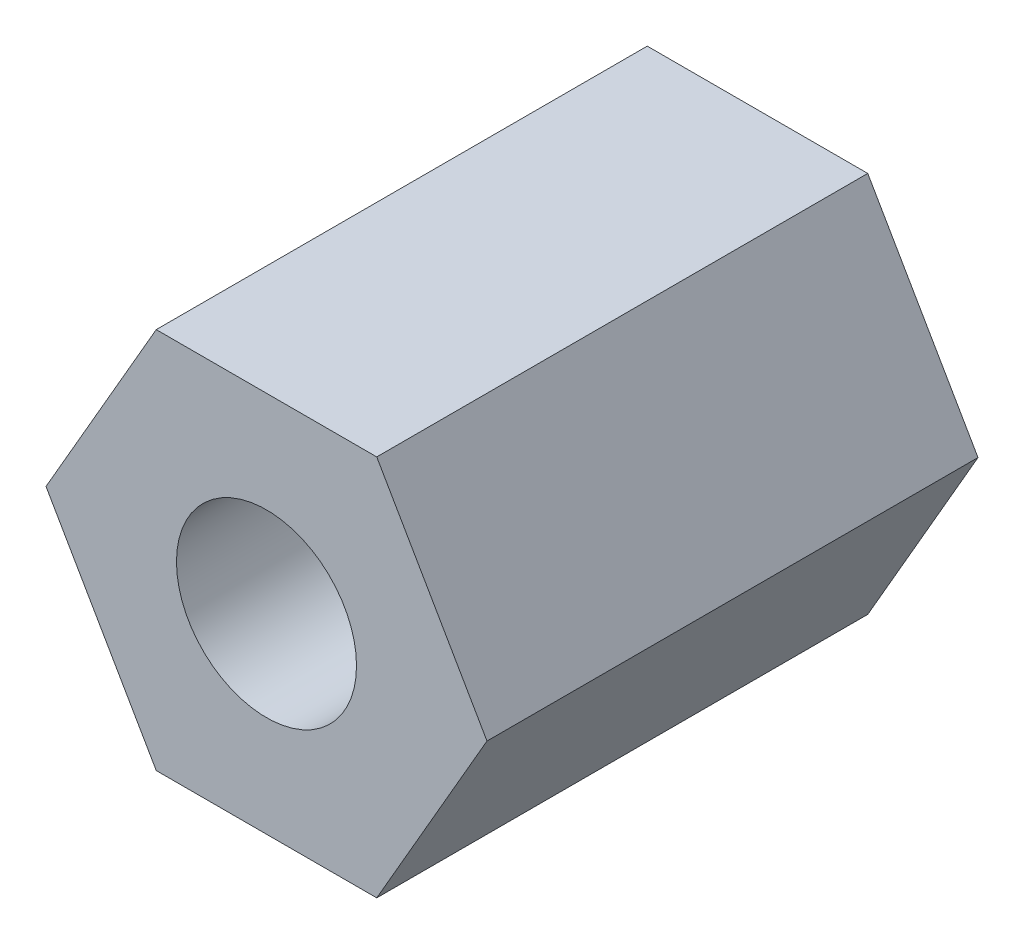
ISO-10303-21;
HEADER;
FILE_DESCRIPTION(('STEP AP214'),'2;1');
FILE_NAME('part.step','',(''),(''),'','','');
FILE_SCHEMA(('AUTOMOTIVE_DESIGN { 1 0 10303 214 1 1 1 1 }'));
ENDSEC;
DATA;
#1=APPLICATION_CONTEXT('core data for automotive mechanical design processes');
#2=APPLICATION_PROTOCOL_DEFINITION('international standard','automotive_design',2000,#1);
#3=PRODUCT_CONTEXT('',#1,'mechanical');
#4=PRODUCT('Part','Part','',(#3));
#5=PRODUCT_RELATED_PRODUCT_CATEGORY('part','',(#4));
#6=PRODUCT_DEFINITION_FORMATION('','',#4);
#7=PRODUCT_DEFINITION_CONTEXT('part definition',#1,'design');
#8=PRODUCT_DEFINITION('design','',#6,#7);
#9=PRODUCT_DEFINITION_SHAPE('','',#8);
#10=(LENGTH_UNIT() NAMED_UNIT(*) SI_UNIT(.MILLI.,.METRE.));
#11=(NAMED_UNIT(*) PLANE_ANGLE_UNIT() SI_UNIT($,.RADIAN.));
#12=(NAMED_UNIT(*) SI_UNIT($,.STERADIAN.) SOLID_ANGLE_UNIT());
#13=UNCERTAINTY_MEASURE_WITH_UNIT(LENGTH_MEASURE(1.E-05),#10,'distance_accuracy_value','');
#14=(GEOMETRIC_REPRESENTATION_CONTEXT(3) GLOBAL_UNCERTAINTY_ASSIGNED_CONTEXT((#13)) GLOBAL_UNIT_ASSIGNED_CONTEXT((#10,
#11,#12)) REPRESENTATION_CONTEXT('',''));
#15=CARTESIAN_POINT('',(0.,0.,0.));
#16=DIRECTION('',(0.,0.,1.));
#17=DIRECTION('',(1.,0.,0.));
#18=AXIS2_PLACEMENT_3D('',#15,#16,#17);
#19=CARTESIAN_POINT('',(2.02072594216369,3.5,9.));
#20=DIRECTION('',(0.,-1.,0.));
#21=DIRECTION('',(1.,0.,0.));
#22=AXIS2_PLACEMENT_3D('',#19,#20,#21);
#23=PLANE('',#22);
#24=DIRECTION('',(-1.,0.,0.));
#25=VECTOR('',#24,1.);
#26=CARTESIAN_POINT('',(2.02072594216369,3.5,0.));
#27=LINE('',#26,#25);
#28=CARTESIAN_POINT('',(2.02072594216369,3.5,0.));
#29=VERTEX_POINT('',#28);
#30=CARTESIAN_POINT('',(-2.02072594216369,3.5,0.));
#31=VERTEX_POINT('',#30);
#32=EDGE_CURVE('E117',#29,#31,#27,.T.);
#33=ORIENTED_EDGE('',*,*,#32,.T.);
#34=DIRECTION('',(0.,0.,-1.));
#35=VECTOR('',#34,1.);
#36=CARTESIAN_POINT('',(-2.02072594216369,3.5,9.));
#37=LINE('',#36,#35);
#38=CARTESIAN_POINT('',(-2.02072594216369,3.5,9.));
#39=VERTEX_POINT('',#38);
#40=EDGE_CURVE('E11',#39,#31,#37,.T.);
#41=ORIENTED_EDGE('',*,*,#40,.F.);
#42=DIRECTION('',(-1.,0.,0.));
#43=VECTOR('',#42,1.);
#44=CARTESIAN_POINT('',(2.02072594216369,3.5,9.));
#45=LINE('',#44,#43);
#46=CARTESIAN_POINT('',(2.02072594216369,3.5,9.));
#47=VERTEX_POINT('',#46);
#48=EDGE_CURVE('E128',#47,#39,#45,.T.);
#49=ORIENTED_EDGE('',*,*,#48,.F.);
#50=DIRECTION('',(0.,0.,-1.));
#51=VECTOR('',#50,1.);
#52=CARTESIAN_POINT('',(2.02072594216369,3.5,9.));
#53=LINE('',#52,#51);
#54=EDGE_CURVE('E113',#47,#29,#53,.T.);
#55=ORIENTED_EDGE('',*,*,#54,.T.);
#56=EDGE_LOOP('',(#33,#41,#49,#55));
#57=FACE_BOUND('',#56,.T.);
#58=ADVANCED_FACE('F33',(#57),#23,.F.);
#59=CARTESIAN_POINT('',(-2.02072594216369,3.5,9.));
#60=DIRECTION('',(0.866025403784439,-0.5,0.));
#61=DIRECTION('',(0.5,0.866025403784439,0.));
#62=AXIS2_PLACEMENT_3D('',#59,#60,#61);
#63=PLANE('',#62);
#64=DIRECTION('',(-0.5,-0.866025403784439,0.));
#65=VECTOR('',#64,1.);
#66=CARTESIAN_POINT('',(-2.02072594216369,3.5,0.));
#67=LINE('',#66,#65);
#68=CARTESIAN_POINT('',(-4.04145188432738,0.,0.));
#69=VERTEX_POINT('',#68);
#70=EDGE_CURVE('E120',#31,#69,#67,.T.);
#71=ORIENTED_EDGE('',*,*,#70,.T.);
#72=DIRECTION('',(0.,0.,-1.));
#73=VECTOR('',#72,1.);
#74=CARTESIAN_POINT('',(-4.04145188432738,0.,9.));
#75=LINE('',#74,#73);
#76=CARTESIAN_POINT('',(-4.04145188432738,0.,9.));
#77=VERTEX_POINT('',#76);
#78=EDGE_CURVE('E41',#77,#69,#75,.T.);
#79=ORIENTED_EDGE('',*,*,#78,.F.);
#80=DIRECTION('',(-0.5,-0.866025403784439,0.));
#81=VECTOR('',#80,1.);
#82=CARTESIAN_POINT('',(-2.02072594216369,3.5,9.));
#83=LINE('',#82,#81);
#84=EDGE_CURVE('E86',#39,#77,#83,.T.);
#85=ORIENTED_EDGE('',*,*,#84,.F.);
#86=ORIENTED_EDGE('',*,*,#40,.T.);
#87=EDGE_LOOP('',(#71,#79,#85,#86));
#88=FACE_BOUND('',#87,.T.);
#89=ADVANCED_FACE('F153',(#88),#63,.F.);
#90=CARTESIAN_POINT('',(-4.04145188432738,0.,9.));
#91=DIRECTION('',(0.866025403784438,0.5,0.));
#92=DIRECTION('',(-0.5,0.866025403784439,0.));
#93=AXIS2_PLACEMENT_3D('',#90,#91,#92);
#94=PLANE('',#93);
#95=DIRECTION('',(0.5,-0.866025403784438,0.));
#96=VECTOR('',#95,1.);
#97=CARTESIAN_POINT('',(-4.04145188432738,0.,0.));
#98=LINE('',#97,#96);
#99=CARTESIAN_POINT('',(-2.02072594216369,-3.5,0.));
#100=VERTEX_POINT('',#99);
#101=EDGE_CURVE('E123',#69,#100,#98,.T.);
#102=ORIENTED_EDGE('',*,*,#101,.T.);
#103=DIRECTION('',(0.,0.,-1.));
#104=VECTOR('',#103,1.);
#105=CARTESIAN_POINT('',(-2.02072594216369,-3.5,9.));
#106=LINE('',#105,#104);
#107=CARTESIAN_POINT('',(-2.02072594216369,-3.5,9.));
#108=VERTEX_POINT('',#107);
#109=EDGE_CURVE('E108',#108,#100,#106,.T.);
#110=ORIENTED_EDGE('',*,*,#109,.F.);
#111=DIRECTION('',(0.5,-0.866025403784438,0.));
#112=VECTOR('',#111,1.);
#113=CARTESIAN_POINT('',(-4.04145188432738,0.,9.));
#114=LINE('',#113,#112);
#115=EDGE_CURVE('E99',#77,#108,#114,.T.);
#116=ORIENTED_EDGE('',*,*,#115,.F.);
#117=ORIENTED_EDGE('',*,*,#78,.T.);
#118=EDGE_LOOP('',(#102,#110,#116,#117));
#119=FACE_BOUND('',#118,.T.);
#120=ADVANCED_FACE('F134',(#119),#94,.F.);
#121=CARTESIAN_POINT('',(-2.02072594216369,-3.5,9.));
#122=DIRECTION('',(0.,1.,0.));
#123=DIRECTION('',(-1.,0.,0.));
#124=AXIS2_PLACEMENT_3D('',#121,#122,#123);
#125=PLANE('',#124);
#126=DIRECTION('',(1.,0.,0.));
#127=VECTOR('',#126,1.);
#128=CARTESIAN_POINT('',(-2.02072594216369,-3.5,0.));
#129=LINE('',#128,#127);
#130=CARTESIAN_POINT('',(2.02072594216369,-3.5,0.));
#131=VERTEX_POINT('',#130);
#132=EDGE_CURVE('E107',#100,#131,#129,.T.);
#133=ORIENTED_EDGE('',*,*,#132,.T.);
#134=DIRECTION('',(0.,0.,-1.));
#135=VECTOR('',#134,1.);
#136=CARTESIAN_POINT('',(2.02072594216369,-3.5,9.));
#137=LINE('',#136,#135);
#138=CARTESIAN_POINT('',(2.02072594216369,-3.5,9.));
#139=VERTEX_POINT('',#138);
#140=EDGE_CURVE('E104',#139,#131,#137,.T.);
#141=ORIENTED_EDGE('',*,*,#140,.F.);
#142=DIRECTION('',(1.,0.,0.));
#143=VECTOR('',#142,1.);
#144=CARTESIAN_POINT('',(-2.02072594216369,-3.5,9.));
#145=LINE('',#144,#143);
#146=EDGE_CURVE('E93',#108,#139,#145,.T.);
#147=ORIENTED_EDGE('',*,*,#146,.F.);
#148=ORIENTED_EDGE('',*,*,#109,.T.);
#149=EDGE_LOOP('',(#133,#141,#147,#148));
#150=FACE_BOUND('',#149,.T.);
#151=ADVANCED_FACE('F105',(#150),#125,.F.);
#152=CARTESIAN_POINT('',(2.02072594216369,-3.5,9.));
#153=DIRECTION('',(-0.866025403784439,0.5,0.));
#154=DIRECTION('',(-0.5,-0.866025403784439,0.));
#155=AXIS2_PLACEMENT_3D('',#152,#153,#154);
#156=PLANE('',#155);
#157=DIRECTION('',(0.5,0.866025403784439,0.));
#158=VECTOR('',#157,1.);
#159=CARTESIAN_POINT('',(2.02072594216369,-3.5,0.));
#160=LINE('',#159,#158);
#161=CARTESIAN_POINT('',(4.04145188432738,0.,0.));
#162=VERTEX_POINT('',#161);
#163=EDGE_CURVE('E72',#131,#162,#160,.T.);
#164=ORIENTED_EDGE('',*,*,#163,.T.);
#165=DIRECTION('',(0.,0.,-1.));
#166=VECTOR('',#165,1.);
#167=CARTESIAN_POINT('',(4.04145188432738,0.,9.));
#168=LINE('',#167,#166);
#169=CARTESIAN_POINT('',(4.04145188432738,0.,9.));
#170=VERTEX_POINT('',#169);
#171=EDGE_CURVE('E109',#170,#162,#168,.T.);
#172=ORIENTED_EDGE('',*,*,#171,.F.);
#173=DIRECTION('',(0.5,0.866025403784439,0.));
#174=VECTOR('',#173,1.);
#175=CARTESIAN_POINT('',(2.02072594216369,-3.5,9.));
#176=LINE('',#175,#174);
#177=EDGE_CURVE('E97',#139,#170,#176,.T.);
#178=ORIENTED_EDGE('',*,*,#177,.F.);
#179=ORIENTED_EDGE('',*,*,#140,.T.);
#180=EDGE_LOOP('',(#164,#172,#178,#179));
#181=FACE_BOUND('',#180,.T.);
#182=ADVANCED_FACE('F111',(#181),#156,.F.);
#183=CARTESIAN_POINT('',(4.04145188432738,0.,9.));
#184=DIRECTION('',(-0.866025403784439,-0.5,0.));
#185=DIRECTION('',(0.5,-0.866025403784439,0.));
#186=AXIS2_PLACEMENT_3D('',#183,#184,#185);
#187=PLANE('',#186);
#188=DIRECTION('',(-0.5,0.866025403784438,0.));
#189=VECTOR('',#188,1.);
#190=CARTESIAN_POINT('',(4.04145188432738,0.,0.));
#191=LINE('',#190,#189);
#192=EDGE_CURVE('E78',#162,#29,#191,.T.);
#193=ORIENTED_EDGE('',*,*,#192,.T.);
#194=ORIENTED_EDGE('',*,*,#54,.F.);
#195=DIRECTION('',(-0.5,0.866025403784438,0.));
#196=VECTOR('',#195,1.);
#197=CARTESIAN_POINT('',(4.04145188432738,0.,9.));
#198=LINE('',#197,#196);
#199=EDGE_CURVE('E49',#170,#47,#198,.T.);
#200=ORIENTED_EDGE('',*,*,#199,.F.);
#201=ORIENTED_EDGE('',*,*,#171,.T.);
#202=EDGE_LOOP('',(#193,#194,#200,#201));
#203=FACE_BOUND('',#202,.T.);
#204=ADVANCED_FACE('F141',(#203),#187,.F.);
#205=CARTESIAN_POINT('',(0.,0.,9.));
#206=DIRECTION('',(0.,0.,1.));
#207=DIRECTION('',(1.,0.,0.));
#208=AXIS2_PLACEMENT_3D('',#205,#206,#207);
#209=PLANE('',#208);
#210=CARTESIAN_POINT('',(0.,0.,9.));
#211=DIRECTION('',(0.,0.,1.));
#212=DIRECTION('',(1.,0.,0.));
#213=AXIS2_PLACEMENT_3D('',#210,#211,#212);
#214=CIRCLE('',#213,1.65);
#215=CARTESIAN_POINT('',(1.65,0.,9.));
#216=VERTEX_POINT('',#215);
#217=EDGE_CURVE('E208',#216,#216,#214,.T.);
#218=ORIENTED_EDGE('',*,*,#217,.F.);
#219=EDGE_LOOP('',(#218));
#220=FACE_BOUND('',#219,.T.);
#221=ORIENTED_EDGE('',*,*,#48,.T.);
#222=ORIENTED_EDGE('',*,*,#84,.T.);
#223=ORIENTED_EDGE('',*,*,#115,.T.);
#224=ORIENTED_EDGE('',*,*,#146,.T.);
#225=ORIENTED_EDGE('',*,*,#177,.T.);
#226=ORIENTED_EDGE('',*,*,#199,.T.);
#227=EDGE_LOOP('',(#221,#222,#223,#224,#225,#226));
#228=FACE_BOUND('',#227,.T.);
#229=ADVANCED_FACE('F95',(#220,#228),#209,.T.);
#230=CARTESIAN_POINT('',(0.,0.,0.));
#231=DIRECTION('',(0.,0.,1.));
#232=DIRECTION('',(1.,0.,0.));
#233=AXIS2_PLACEMENT_3D('',#230,#231,#232);
#234=PLANE('',#233);
#235=CARTESIAN_POINT('',(0.,0.,0.));
#236=DIRECTION('',(0.,0.,1.));
#237=DIRECTION('',(1.,0.,0.));
#238=AXIS2_PLACEMENT_3D('',#235,#236,#237);
#239=CIRCLE('',#238,1.65);
#240=CARTESIAN_POINT('',(1.65,0.,0.));
#241=VERTEX_POINT('',#240);
#242=EDGE_CURVE('E121',#241,#241,#239,.T.);
#243=ORIENTED_EDGE('',*,*,#242,.T.);
#244=EDGE_LOOP('',(#243));
#245=FACE_BOUND('',#244,.T.);
#246=ORIENTED_EDGE('',*,*,#32,.F.);
#247=ORIENTED_EDGE('',*,*,#192,.F.);
#248=ORIENTED_EDGE('',*,*,#163,.F.);
#249=ORIENTED_EDGE('',*,*,#132,.F.);
#250=ORIENTED_EDGE('',*,*,#101,.F.);
#251=ORIENTED_EDGE('',*,*,#70,.F.);
#252=EDGE_LOOP('',(#246,#247,#248,#249,#250,#251));
#253=FACE_BOUND('',#252,.T.);
#254=ADVANCED_FACE('F137',(#245,#253),#234,.F.);
#255=CARTESIAN_POINT('',(0.,0.,9.));
#256=DIRECTION('',(0.,0.,1.));
#257=DIRECTION('',(1.,0.,0.));
#258=AXIS2_PLACEMENT_3D('',#255,#256,#257);
#259=CYLINDRICAL_SURFACE('',#258,1.65);
#260=ORIENTED_EDGE('',*,*,#242,.F.);
#261=EDGE_LOOP('',(#260));
#262=FACE_BOUND('',#261,.T.);
#263=ORIENTED_EDGE('',*,*,#217,.T.);
#264=EDGE_LOOP('',(#263));
#265=FACE_BOUND('',#264,.T.);
#266=ADVANCED_FACE('F190',(#262,#265),#259,.F.);
#267=CLOSED_SHELL('',(#58,#89,#120,#151,#182,#204,#229,#254,#266));
#268=MANIFOLD_SOLID_BREP('B2',#267);
#269=ADVANCED_BREP_SHAPE_REPRESENTATION('',(#18,#268),#14);
#270=SHAPE_DEFINITION_REPRESENTATION(#9,#269);
ENDSEC;
END-ISO-10303-21;
